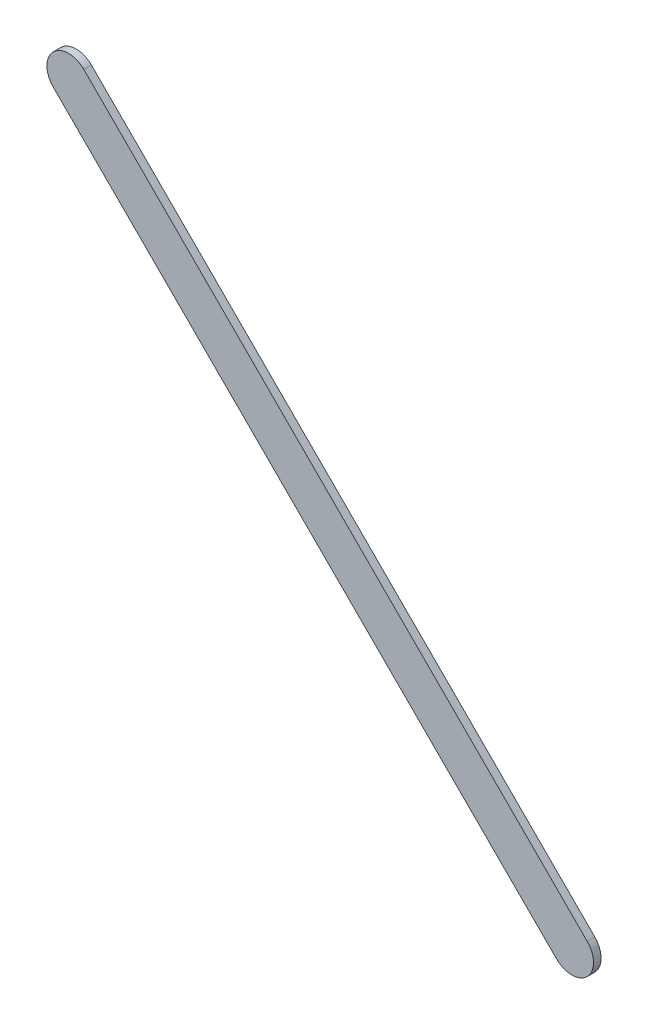
ISO-10303-21;
HEADER;
FILE_DESCRIPTION(('STEP AP214'),'2;1');
FILE_NAME('part.step','',(''),(''),'','','');
FILE_SCHEMA(('AUTOMOTIVE_DESIGN { 1 0 10303 214 1 1 1 1 }'));
ENDSEC;
DATA;
#1=APPLICATION_CONTEXT('core data for automotive mechanical design processes');
#2=APPLICATION_PROTOCOL_DEFINITION('international standard','automotive_design',2000,#1);
#3=PRODUCT_CONTEXT('',#1,'mechanical');
#4=PRODUCT('Part','Part','',(#3));
#5=PRODUCT_RELATED_PRODUCT_CATEGORY('part','',(#4));
#6=PRODUCT_DEFINITION_FORMATION('','',#4);
#7=PRODUCT_DEFINITION_CONTEXT('part definition',#1,'design');
#8=PRODUCT_DEFINITION('design','',#6,#7);
#9=PRODUCT_DEFINITION_SHAPE('','',#8);
#10=(LENGTH_UNIT() NAMED_UNIT(*) SI_UNIT(.MILLI.,.METRE.));
#11=(NAMED_UNIT(*) PLANE_ANGLE_UNIT() SI_UNIT($,.RADIAN.));
#12=(NAMED_UNIT(*) SI_UNIT($,.STERADIAN.) SOLID_ANGLE_UNIT());
#13=UNCERTAINTY_MEASURE_WITH_UNIT(LENGTH_MEASURE(1.E-05),#10,'distance_accuracy_value','');
#14=(GEOMETRIC_REPRESENTATION_CONTEXT(3) GLOBAL_UNCERTAINTY_ASSIGNED_CONTEXT((#13)) GLOBAL_UNIT_ASSIGNED_CONTEXT((#10,
#11,#12)) REPRESENTATION_CONTEXT('',''));
#15=CARTESIAN_POINT('',(0.,0.,0.));
#16=DIRECTION('',(0.,0.,1.));
#17=DIRECTION('',(1.,0.,0.));
#18=AXIS2_PLACEMENT_3D('',#15,#16,#17);
#19=CARTESIAN_POINT('',(84.697106,-128.311371,1.635));
#20=DIRECTION('',(0.,0.,1.));
#21=DIRECTION('',(1.,0.,0.));
#22=AXIS2_PLACEMENT_3D('',#19,#20,#21);
#23=PLANE('',#22);
#24=DIRECTION('',(-0.707106781186548,0.707106781186548,0.));
#25=VECTOR('',#24,1.);
#26=CARTESIAN_POINT('',(84.697106,-128.311371,1.635));
#27=LINE('',#26,#25);
#28=CARTESIAN_POINT('',(84.697106,-128.311371,1.635));
#29=VERTEX_POINT('',#28);
#30=CARTESIAN_POINT('',(82.37071,-125.984975,1.635));
#31=VERTEX_POINT('',#30);
#32=EDGE_CURVE('E78',#29,#31,#27,.T.);
#33=ORIENTED_EDGE('',*,*,#32,.T.);
#34=CARTESIAN_POINT('',(82.2999995,-126.0556855,1.635));
#35=DIRECTION('',(0.,0.,1.));
#36=DIRECTION('',(0.707106781186548,0.707106781186548,0.));
#37=AXIS2_PLACEMENT_3D('',#34,#35,#36);
#38=CIRCLE('',#37,0.09999974810219);
#39=CARTESIAN_POINT('',(82.229289,-126.126396,1.635));
#40=VERTEX_POINT('',#39);
#41=EDGE_CURVE('E76',#31,#40,#38,.T.);
#42=ORIENTED_EDGE('',*,*,#41,.T.);
#43=DIRECTION('',(0.707106781186548,-0.707106781186548,0.));
#44=VECTOR('',#43,1.);
#45=CARTESIAN_POINT('',(82.229289,-126.126396,1.635));
#46=LINE('',#45,#44);
#47=CARTESIAN_POINT('',(84.555685,-128.452792,1.635));
#48=VERTEX_POINT('',#47);
#49=EDGE_CURVE('E65',#40,#48,#46,.T.);
#50=ORIENTED_EDGE('',*,*,#49,.T.);
#51=CARTESIAN_POINT('',(84.6263955,-128.3820815,1.635));
#52=DIRECTION('',(0.,0.,1.));
#53=DIRECTION('',(-0.707106781187048,-0.707106781186048,0.));
#54=AXIS2_PLACEMENT_3D('',#51,#52,#53);
#55=CIRCLE('',#54,0.09999974810218);
#56=EDGE_CURVE('E11',#48,#29,#55,.T.);
#57=ORIENTED_EDGE('',*,*,#56,.T.);
#58=EDGE_LOOP('',(#33,#42,#50,#57));
#59=FACE_BOUND('',#58,.T.);
#60=ADVANCED_FACE('F17',(#59),#23,.T.);
#61=CARTESIAN_POINT('',(84.697106,-128.311371,1.6));
#62=DIRECTION('',(0.,0.,1.));
#63=DIRECTION('',(1.,0.,0.));
#64=AXIS2_PLACEMENT_3D('',#61,#62,#63);
#65=PLANE('',#64);
#66=CARTESIAN_POINT('',(84.6263955,-128.3820815,1.6));
#67=DIRECTION('',(0.,0.,1.));
#68=DIRECTION('',(-0.707106781187048,-0.707106781186048,0.));
#69=AXIS2_PLACEMENT_3D('',#66,#67,#68);
#70=CIRCLE('',#69,0.09999974810218);
#71=CARTESIAN_POINT('',(84.555685,-128.452792,1.6));
#72=VERTEX_POINT('',#71);
#73=CARTESIAN_POINT('',(84.697106,-128.311371,1.6));
#74=VERTEX_POINT('',#73);
#75=EDGE_CURVE('E26',#72,#74,#70,.T.);
#76=ORIENTED_EDGE('',*,*,#75,.F.);
#77=DIRECTION('',(0.707106781186548,-0.707106781186548,0.));
#78=VECTOR('',#77,1.);
#79=CARTESIAN_POINT('',(82.229289,-126.126396,1.6));
#80=LINE('',#79,#78);
#81=CARTESIAN_POINT('',(82.229289,-126.126396,1.6));
#82=VERTEX_POINT('',#81);
#83=EDGE_CURVE('E83',#82,#72,#80,.T.);
#84=ORIENTED_EDGE('',*,*,#83,.F.);
#85=CARTESIAN_POINT('',(82.2999995,-126.0556855,1.6));
#86=DIRECTION('',(0.,0.,1.));
#87=DIRECTION('',(0.707106781186548,0.707106781186548,0.));
#88=AXIS2_PLACEMENT_3D('',#85,#86,#87);
#89=CIRCLE('',#88,0.09999974810219);
#90=CARTESIAN_POINT('',(82.37071,-125.984975,1.6));
#91=VERTEX_POINT('',#90);
#92=EDGE_CURVE('E86',#91,#82,#89,.T.);
#93=ORIENTED_EDGE('',*,*,#92,.F.);
#94=DIRECTION('',(-0.707106781186548,0.707106781186548,0.));
#95=VECTOR('',#94,1.);
#96=CARTESIAN_POINT('',(84.697106,-128.311371,1.6));
#97=LINE('',#96,#95);
#98=EDGE_CURVE('E133',#74,#91,#97,.T.);
#99=ORIENTED_EDGE('',*,*,#98,.F.);
#100=EDGE_LOOP('',(#76,#84,#93,#99));
#101=FACE_BOUND('',#100,.T.);
#102=ADVANCED_FACE('F150',(#101),#65,.F.);
#103=CARTESIAN_POINT('',(84.6263955,-128.3820815,1.6));
#104=DIRECTION('',(0.,0.,-1.));
#105=DIRECTION('',(-0.707106781187048,-0.707106781186048,0.));
#106=AXIS2_PLACEMENT_3D('',#103,#104,#105);
#107=CYLINDRICAL_SURFACE('',#106,0.09999974810218);
#108=ORIENTED_EDGE('',*,*,#75,.T.);
#109=DIRECTION('',(0.,0.,1.));
#110=VECTOR('',#109,1.);
#111=CARTESIAN_POINT('',(84.697106,-128.311371,1.6));
#112=LINE('',#111,#110);
#113=EDGE_CURVE('E93',#74,#29,#112,.T.);
#114=ORIENTED_EDGE('',*,*,#113,.T.);
#115=ORIENTED_EDGE('',*,*,#56,.F.);
#116=DIRECTION('',(0.,0.,1.));
#117=VECTOR('',#116,1.);
#118=CARTESIAN_POINT('',(84.555685,-128.452792,1.6));
#119=LINE('',#118,#117);
#120=EDGE_CURVE('E72',#72,#48,#119,.T.);
#121=ORIENTED_EDGE('',*,*,#120,.F.);
#122=EDGE_LOOP('',(#108,#114,#115,#121));
#123=FACE_BOUND('',#122,.T.);
#124=ADVANCED_FACE('F151',(#123),#107,.T.);
#125=CARTESIAN_POINT('',(82.229289,-126.126396,1.6));
#126=DIRECTION('',(0.707106781186548,0.707106781186548,0.));
#127=DIRECTION('',(0.,0.,-1.));
#128=AXIS2_PLACEMENT_3D('',#125,#126,#127);
#129=PLANE('',#128);
#130=ORIENTED_EDGE('',*,*,#83,.T.);
#131=ORIENTED_EDGE('',*,*,#120,.T.);
#132=ORIENTED_EDGE('',*,*,#49,.F.);
#133=DIRECTION('',(0.,0.,1.));
#134=VECTOR('',#133,1.);
#135=CARTESIAN_POINT('',(82.229289,-126.126396,1.6));
#136=LINE('',#135,#134);
#137=EDGE_CURVE('E70',#82,#40,#136,.T.);
#138=ORIENTED_EDGE('',*,*,#137,.F.);
#139=EDGE_LOOP('',(#130,#131,#132,#138));
#140=FACE_BOUND('',#139,.T.);
#141=ADVANCED_FACE('F68',(#140),#129,.F.);
#142=CARTESIAN_POINT('',(82.2999995,-126.0556855,1.6));
#143=DIRECTION('',(0.,0.,-1.));
#144=DIRECTION('',(0.707106781186548,0.707106781186548,0.));
#145=AXIS2_PLACEMENT_3D('',#142,#143,#144);
#146=CYLINDRICAL_SURFACE('',#145,0.09999974810219);
#147=ORIENTED_EDGE('',*,*,#92,.T.);
#148=ORIENTED_EDGE('',*,*,#137,.T.);
#149=ORIENTED_EDGE('',*,*,#41,.F.);
#150=DIRECTION('',(0.,0.,1.));
#151=VECTOR('',#150,1.);
#152=CARTESIAN_POINT('',(82.37071,-125.984975,1.6));
#153=LINE('',#152,#151);
#154=EDGE_CURVE('E127',#91,#31,#153,.T.);
#155=ORIENTED_EDGE('',*,*,#154,.F.);
#156=EDGE_LOOP('',(#147,#148,#149,#155));
#157=FACE_BOUND('',#156,.T.);
#158=ADVANCED_FACE('F85',(#157),#146,.T.);
#159=CARTESIAN_POINT('',(84.697106,-128.311371,1.6));
#160=DIRECTION('',(-0.707106781186548,-0.707106781186548,0.));
#161=DIRECTION('',(-0.707106781186548,0.707106781186548,0.));
#162=AXIS2_PLACEMENT_3D('',#159,#160,#161);
#163=PLANE('',#162);
#164=ORIENTED_EDGE('',*,*,#98,.T.);
#165=ORIENTED_EDGE('',*,*,#154,.T.);
#166=ORIENTED_EDGE('',*,*,#32,.F.);
#167=ORIENTED_EDGE('',*,*,#113,.F.);
#168=EDGE_LOOP('',(#164,#165,#166,#167));
#169=FACE_BOUND('',#168,.T.);
#170=ADVANCED_FACE('F148',(#169),#163,.F.);
#171=CLOSED_SHELL('',(#60,#102,#124,#141,#158,#170));
#172=MANIFOLD_SOLID_BREP('B1',#171);
#173=ADVANCED_BREP_SHAPE_REPRESENTATION('',(#18,#172),#14);
#174=SHAPE_DEFINITION_REPRESENTATION(#9,#173);
ENDSEC;
END-ISO-10303-21;
